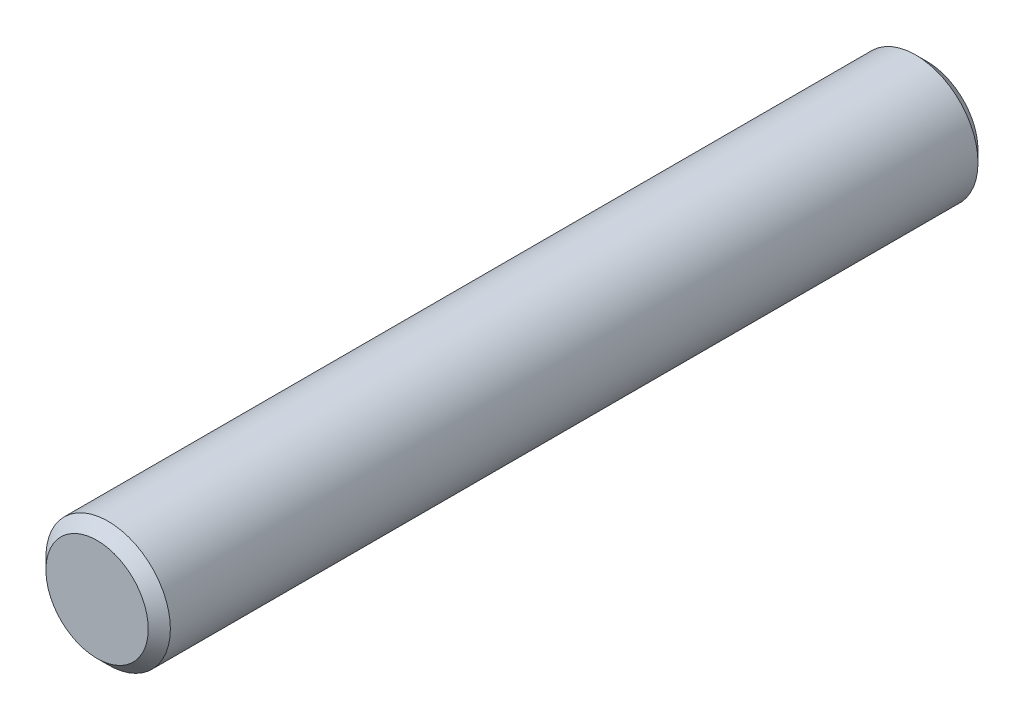
ISO-10303-21;
HEADER;
FILE_DESCRIPTION(('STEP AP214'),'2;1');
FILE_NAME('part.step','',(''),(''),'','','');
FILE_SCHEMA(('AUTOMOTIVE_DESIGN { 1 0 10303 214 1 1 1 1 }'));
ENDSEC;
DATA;
#1=APPLICATION_CONTEXT('core data for automotive mechanical design processes');
#2=APPLICATION_PROTOCOL_DEFINITION('international standard','automotive_design',2000,#1);
#3=PRODUCT_CONTEXT('',#1,'mechanical');
#4=PRODUCT('Part','Part','',(#3));
#5=PRODUCT_RELATED_PRODUCT_CATEGORY('part','',(#4));
#6=PRODUCT_DEFINITION_FORMATION('','',#4);
#7=PRODUCT_DEFINITION_CONTEXT('part definition',#1,'design');
#8=PRODUCT_DEFINITION('design','',#6,#7);
#9=PRODUCT_DEFINITION_SHAPE('','',#8);
#10=(LENGTH_UNIT() NAMED_UNIT(*) SI_UNIT(.MILLI.,.METRE.));
#11=(NAMED_UNIT(*) PLANE_ANGLE_UNIT() SI_UNIT($,.RADIAN.));
#12=(NAMED_UNIT(*) SI_UNIT($,.STERADIAN.) SOLID_ANGLE_UNIT());
#13=UNCERTAINTY_MEASURE_WITH_UNIT(LENGTH_MEASURE(1.E-05),#10,'distance_accuracy_value','');
#14=(GEOMETRIC_REPRESENTATION_CONTEXT(3) GLOBAL_UNCERTAINTY_ASSIGNED_CONTEXT((#13)) GLOBAL_UNIT_ASSIGNED_CONTEXT((#10,
#11,#12)) REPRESENTATION_CONTEXT('',''));
#15=CARTESIAN_POINT('',(0.,0.,0.));
#16=DIRECTION('',(0.,0.,1.));
#17=DIRECTION('',(1.,0.,0.));
#18=AXIS2_PLACEMENT_3D('',#15,#16,#17);
#19=CARTESIAN_POINT('',(0.,0.,60.));
#20=DIRECTION('',(0.,0.,-1.));
#21=DIRECTION('',(-1.,0.,0.));
#22=AXIS2_PLACEMENT_3D('',#19,#20,#21);
#23=CYLINDRICAL_SURFACE('',#22,4.5);
#24=CARTESIAN_POINT('',(0.,0.,0.799999999999988));
#25=DIRECTION('',(0.,0.,1.));
#26=DIRECTION('',(1.,0.,0.));
#27=AXIS2_PLACEMENT_3D('',#24,#25,#26);
#28=CIRCLE('',#27,4.5);
#29=CARTESIAN_POINT('',(4.5,0.,0.799999999999988));
#30=VERTEX_POINT('',#29);
#31=EDGE_CURVE('E42',#30,#30,#28,.T.);
#32=ORIENTED_EDGE('',*,*,#31,.T.);
#33=EDGE_LOOP('',(#32));
#34=FACE_BOUND('',#33,.T.);
#35=CARTESIAN_POINT('',(0.,0.,59.2));
#36=DIRECTION('',(0.,0.,1.));
#37=DIRECTION('',(1.,0.,0.));
#38=AXIS2_PLACEMENT_3D('',#35,#36,#37);
#39=CIRCLE('',#38,4.5);
#40=CARTESIAN_POINT('',(4.5,0.,59.2));
#41=VERTEX_POINT('',#40);
#42=EDGE_CURVE('E46',#41,#41,#39,.F.);
#43=ORIENTED_EDGE('',*,*,#42,.T.);
#44=EDGE_LOOP('',(#43));
#45=FACE_BOUND('',#44,.T.);
#46=ADVANCED_FACE('F31',(#34,#45),#23,.T.);
#47=CARTESIAN_POINT('',(0.,0.,60.));
#48=DIRECTION('',(0.,0.,1.));
#49=DIRECTION('',(1.,0.,0.));
#50=AXIS2_PLACEMENT_3D('',#47,#48,#49);
#51=PLANE('',#50);
#52=CARTESIAN_POINT('',(0.,0.,60.));
#53=DIRECTION('',(0.,0.,1.));
#54=DIRECTION('',(1.,0.,0.));
#55=AXIS2_PLACEMENT_3D('',#52,#53,#54);
#56=CIRCLE('',#55,3.69999999999999);
#57=CARTESIAN_POINT('',(3.69999999999999,0.,60.));
#58=VERTEX_POINT('',#57);
#59=EDGE_CURVE('E10',#58,#58,#56,.T.);
#60=ORIENTED_EDGE('',*,*,#59,.T.);
#61=EDGE_LOOP('',(#60));
#62=FACE_BOUND('',#61,.T.);
#63=ADVANCED_FACE('F62',(#62),#51,.T.);
#64=CARTESIAN_POINT('',(0.,0.,0.));
#65=DIRECTION('',(0.,0.,1.));
#66=DIRECTION('',(1.,0.,0.));
#67=AXIS2_PLACEMENT_3D('',#64,#65,#66);
#68=PLANE('',#67);
#69=CARTESIAN_POINT('',(0.,0.,0.));
#70=DIRECTION('',(0.,0.,1.));
#71=DIRECTION('',(1.,0.,0.));
#72=AXIS2_PLACEMENT_3D('',#69,#70,#71);
#73=CIRCLE('',#72,3.70000000000001);
#74=CARTESIAN_POINT('',(3.70000000000001,0.,0.));
#75=VERTEX_POINT('',#74);
#76=EDGE_CURVE('E38',#75,#75,#73,.F.);
#77=ORIENTED_EDGE('',*,*,#76,.T.);
#78=EDGE_LOOP('',(#77));
#79=FACE_BOUND('',#78,.T.);
#80=ADVANCED_FACE('F59',(#79),#68,.F.);
#81=CARTESIAN_POINT('',(0.,0.,0.799999999999988));
#82=DIRECTION('',(0.,0.,1.));
#83=DIRECTION('',(1.,0.,0.));
#84=AXIS2_PLACEMENT_3D('',#81,#82,#83);
#85=CONICAL_SURFACE('',#84,4.5,0.78539816339745);
#86=ORIENTED_EDGE('',*,*,#76,.F.);
#87=EDGE_LOOP('',(#86));
#88=FACE_BOUND('',#87,.T.);
#89=ORIENTED_EDGE('',*,*,#31,.F.);
#90=EDGE_LOOP('',(#89));
#91=FACE_BOUND('',#90,.T.);
#92=ADVANCED_FACE('F55',(#88,#91),#85,.T.);
#93=CARTESIAN_POINT('',(0.,0.,60.));
#94=DIRECTION('',(0.,0.,-1.));
#95=DIRECTION('',(-1.,0.,0.));
#96=AXIS2_PLACEMENT_3D('',#93,#94,#95);
#97=CONICAL_SURFACE('',#96,3.69999999999999,0.78539816339745);
#98=ORIENTED_EDGE('',*,*,#42,.F.);
#99=EDGE_LOOP('',(#98));
#100=FACE_BOUND('',#99,.T.);
#101=ORIENTED_EDGE('',*,*,#59,.F.);
#102=EDGE_LOOP('',(#101));
#103=FACE_BOUND('',#102,.T.);
#104=ADVANCED_FACE('F33',(#100,#103),#97,.T.);
#105=CLOSED_SHELL('',(#46,#63,#80,#92,#104));
#106=MANIFOLD_SOLID_BREP('B2',#105);
#107=ADVANCED_BREP_SHAPE_REPRESENTATION('',(#18,#106),#14);
#108=SHAPE_DEFINITION_REPRESENTATION(#9,#107);
ENDSEC;
END-ISO-10303-21;
